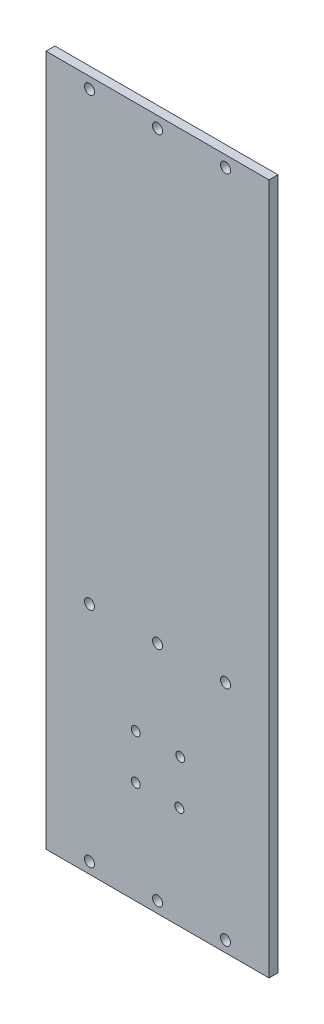
ISO-10303-21;
HEADER;
FILE_DESCRIPTION(('STEP AP214'),'2;1');
FILE_NAME('part.step','',(''),(''),'','','');
FILE_SCHEMA(('AUTOMOTIVE_DESIGN { 1 0 10303 214 1 1 1 1 }'));
ENDSEC;
DATA;
#1=APPLICATION_CONTEXT('core data for automotive mechanical design processes');
#2=APPLICATION_PROTOCOL_DEFINITION('international standard','automotive_design',2000,#1);
#3=PRODUCT_CONTEXT('',#1,'mechanical');
#4=PRODUCT('Part','Part','',(#3));
#5=PRODUCT_RELATED_PRODUCT_CATEGORY('part','',(#4));
#6=PRODUCT_DEFINITION_FORMATION('','',#4);
#7=PRODUCT_DEFINITION_CONTEXT('part definition',#1,'design');
#8=PRODUCT_DEFINITION('design','',#6,#7);
#9=PRODUCT_DEFINITION_SHAPE('','',#8);
#10=(LENGTH_UNIT() NAMED_UNIT(*) SI_UNIT(.MILLI.,.METRE.));
#11=(NAMED_UNIT(*) PLANE_ANGLE_UNIT() SI_UNIT($,.RADIAN.));
#12=(NAMED_UNIT(*) SI_UNIT($,.STERADIAN.) SOLID_ANGLE_UNIT());
#13=UNCERTAINTY_MEASURE_WITH_UNIT(LENGTH_MEASURE(1.E-05),#10,'distance_accuracy_value','');
#14=(GEOMETRIC_REPRESENTATION_CONTEXT(3) GLOBAL_UNCERTAINTY_ASSIGNED_CONTEXT((#13)) GLOBAL_UNIT_ASSIGNED_CONTEXT((#10,
#11,#12)) REPRESENTATION_CONTEXT('',''));
#15=CARTESIAN_POINT('',(0.,0.,0.));
#16=DIRECTION('',(0.,0.,1.));
#17=DIRECTION('',(1.,0.,0.));
#18=AXIS2_PLACEMENT_3D('',#15,#16,#17);
#19=CARTESIAN_POINT('',(0.,0.,-4.));
#20=DIRECTION('',(-1.,0.,0.));
#21=DIRECTION('',(0.,-1.,0.));
#22=AXIS2_PLACEMENT_3D('',#19,#20,#21);
#23=PLANE('',#22);
#24=DIRECTION('',(0.,-1.,0.));
#25=VECTOR('',#24,1.);
#26=CARTESIAN_POINT('',(0.,0.,0.));
#27=LINE('',#26,#25);
#28=CARTESIAN_POINT('',(0.,310.,0.));
#29=VERTEX_POINT('',#28);
#30=CARTESIAN_POINT('',(0.,0.,0.));
#31=VERTEX_POINT('',#30);
#32=EDGE_CURVE('E98',#29,#31,#27,.T.);
#33=ORIENTED_EDGE('',*,*,#32,.F.);
#34=DIRECTION('',(0.,0.,1.));
#35=VECTOR('',#34,1.);
#36=CARTESIAN_POINT('',(0.,310.,-4.));
#37=LINE('',#36,#35);
#38=CARTESIAN_POINT('',(0.,310.,-4.));
#39=VERTEX_POINT('',#38);
#40=EDGE_CURVE('E11',#39,#29,#37,.T.);
#41=ORIENTED_EDGE('',*,*,#40,.F.);
#42=DIRECTION('',(0.,-1.,0.));
#43=VECTOR('',#42,1.);
#44=CARTESIAN_POINT('',(0.,0.,-4.));
#45=LINE('',#44,#43);
#46=CARTESIAN_POINT('',(0.,0.,-4.));
#47=VERTEX_POINT('',#46);
#48=EDGE_CURVE('E91',#39,#47,#45,.T.);
#49=ORIENTED_EDGE('',*,*,#48,.T.);
#50=DIRECTION('',(0.,0.,1.));
#51=VECTOR('',#50,1.);
#52=CARTESIAN_POINT('',(0.,0.,-4.));
#53=LINE('',#52,#51);
#54=EDGE_CURVE('E36',#47,#31,#53,.T.);
#55=ORIENTED_EDGE('',*,*,#54,.T.);
#56=EDGE_LOOP('',(#33,#41,#49,#55));
#57=FACE_BOUND('',#56,.T.);
#58=ADVANCED_FACE('F33',(#57),#23,.T.);
#59=CARTESIAN_POINT('',(0.,310.,-4.));
#60=DIRECTION('',(0.,1.,0.));
#61=DIRECTION('',(0.,0.,1.));
#62=AXIS2_PLACEMENT_3D('',#59,#60,#61);
#63=PLANE('',#62);
#64=DIRECTION('',(-1.,0.,0.));
#65=VECTOR('',#64,1.);
#66=CARTESIAN_POINT('',(0.,310.,0.));
#67=LINE('',#66,#65);
#68=CARTESIAN_POINT('',(100.,310.,0.));
#69=VERTEX_POINT('',#68);
#70=EDGE_CURVE('E93',#69,#29,#67,.T.);
#71=ORIENTED_EDGE('',*,*,#70,.F.);
#72=DIRECTION('',(0.,0.,1.));
#73=VECTOR('',#72,1.);
#74=CARTESIAN_POINT('',(100.,310.,-4.));
#75=LINE('',#74,#73);
#76=CARTESIAN_POINT('',(100.,310.,-4.));
#77=VERTEX_POINT('',#76);
#78=EDGE_CURVE('E42',#77,#69,#75,.T.);
#79=ORIENTED_EDGE('',*,*,#78,.F.);
#80=DIRECTION('',(-1.,0.,0.));
#81=VECTOR('',#80,1.);
#82=CARTESIAN_POINT('',(0.,310.,-4.));
#83=LINE('',#82,#81);
#84=EDGE_CURVE('E88',#77,#39,#83,.T.);
#85=ORIENTED_EDGE('',*,*,#84,.T.);
#86=ORIENTED_EDGE('',*,*,#40,.T.);
#87=EDGE_LOOP('',(#71,#79,#85,#86));
#88=FACE_BOUND('',#87,.T.);
#89=ADVANCED_FACE('F109',(#88),#63,.T.);
#90=CARTESIAN_POINT('',(100.,0.,-4.));
#91=DIRECTION('',(1.,0.,0.));
#92=DIRECTION('',(0.,1.,0.));
#93=AXIS2_PLACEMENT_3D('',#90,#91,#92);
#94=PLANE('',#93);
#95=DIRECTION('',(0.,1.,0.));
#96=VECTOR('',#95,1.);
#97=CARTESIAN_POINT('',(100.,0.,0.));
#98=LINE('',#97,#96);
#99=CARTESIAN_POINT('',(100.,0.,0.));
#100=VERTEX_POINT('',#99);
#101=EDGE_CURVE('E83',#100,#69,#98,.T.);
#102=ORIENTED_EDGE('',*,*,#101,.F.);
#103=DIRECTION('',(0.,0.,1.));
#104=VECTOR('',#103,1.);
#105=CARTESIAN_POINT('',(100.,0.,-4.));
#106=LINE('',#105,#104);
#107=CARTESIAN_POINT('',(100.,0.,-4.));
#108=VERTEX_POINT('',#107);
#109=EDGE_CURVE('E78',#108,#100,#106,.T.);
#110=ORIENTED_EDGE('',*,*,#109,.F.);
#111=DIRECTION('',(0.,1.,0.));
#112=VECTOR('',#111,1.);
#113=CARTESIAN_POINT('',(100.,0.,-4.));
#114=LINE('',#113,#112);
#115=EDGE_CURVE('E81',#108,#77,#114,.T.);
#116=ORIENTED_EDGE('',*,*,#115,.T.);
#117=ORIENTED_EDGE('',*,*,#78,.T.);
#118=EDGE_LOOP('',(#102,#110,#116,#117));
#119=FACE_BOUND('',#118,.T.);
#120=ADVANCED_FACE('F80',(#119),#94,.T.);
#121=CARTESIAN_POINT('',(0.,0.,-4.));
#122=DIRECTION('',(0.,-1.,0.));
#123=DIRECTION('',(0.,0.,-1.));
#124=AXIS2_PLACEMENT_3D('',#121,#122,#123);
#125=PLANE('',#124);
#126=DIRECTION('',(1.,0.,0.));
#127=VECTOR('',#126,1.);
#128=CARTESIAN_POINT('',(0.,0.,0.));
#129=LINE('',#128,#127);
#130=EDGE_CURVE('E101',#31,#100,#129,.T.);
#131=ORIENTED_EDGE('',*,*,#130,.F.);
#132=ORIENTED_EDGE('',*,*,#54,.F.);
#133=DIRECTION('',(1.,0.,0.));
#134=VECTOR('',#133,1.);
#135=CARTESIAN_POINT('',(0.,0.,-4.));
#136=LINE('',#135,#134);
#137=EDGE_CURVE('E87',#47,#108,#136,.T.);
#138=ORIENTED_EDGE('',*,*,#137,.T.);
#139=ORIENTED_EDGE('',*,*,#109,.T.);
#140=EDGE_LOOP('',(#131,#132,#138,#139));
#141=FACE_BOUND('',#140,.T.);
#142=ADVANCED_FACE('F90',(#141),#125,.T.);
#143=CARTESIAN_POINT('',(0.,0.,-4.));
#144=DIRECTION('',(0.,0.,-1.));
#145=DIRECTION('',(-1.,0.,0.));
#146=AXIS2_PLACEMENT_3D('',#143,#144,#145);
#147=PLANE('',#146);
#148=CARTESIAN_POINT('',(19.5,105.,-4.));
#149=DIRECTION('',(0.,0.,1.));
#150=DIRECTION('',(1.,0.,0.));
#151=AXIS2_PLACEMENT_3D('',#148,#149,#150);
#152=CIRCLE('',#151,2.25);
#153=CARTESIAN_POINT('',(21.75,105.,-4.));
#154=VERTEX_POINT('',#153);
#155=EDGE_CURVE('E186',#154,#154,#152,.T.);
#156=ORIENTED_EDGE('',*,*,#155,.T.);
#157=EDGE_LOOP('',(#156));
#158=FACE_BOUND('',#157,.T.);
#159=CARTESIAN_POINT('',(80.5,105.,-4.));
#160=DIRECTION('',(0.,0.,1.));
#161=DIRECTION('',(-1.,0.,0.));
#162=AXIS2_PLACEMENT_3D('',#159,#160,#161);
#163=CIRCLE('',#162,2.25);
#164=CARTESIAN_POINT('',(78.25,105.,-4.));
#165=VERTEX_POINT('',#164);
#166=EDGE_CURVE('E194',#165,#165,#163,.T.);
#167=ORIENTED_EDGE('',*,*,#166,.T.);
#168=EDGE_LOOP('',(#167));
#169=FACE_BOUND('',#168,.T.);
#170=CARTESIAN_POINT('',(50.,105.,-4.));
#171=DIRECTION('',(0.,0.,1.));
#172=DIRECTION('',(1.,0.,0.));
#173=AXIS2_PLACEMENT_3D('',#170,#171,#172);
#174=CIRCLE('',#173,2.25);
#175=CARTESIAN_POINT('',(52.25,105.,-4.));
#176=VERTEX_POINT('',#175);
#177=EDGE_CURVE('E200',#176,#176,#174,.T.);
#178=ORIENTED_EDGE('',*,*,#177,.T.);
#179=EDGE_LOOP('',(#178));
#180=FACE_BOUND('',#179,.T.);
#181=CARTESIAN_POINT('',(60.2076344161803,66.000000000008,-4.));
#182=DIRECTION('',(0.,0.,1.));
#183=DIRECTION('',(1.,0.,0.));
#184=AXIS2_PLACEMENT_3D('',#181,#182,#183);
#185=CIRCLE('',#184,2.);
#186=CARTESIAN_POINT('',(62.2076344161803,66.000000000008,-4.));
#187=VERTEX_POINT('',#186);
#188=EDGE_CURVE('E206',#187,#187,#185,.T.);
#189=ORIENTED_EDGE('',*,*,#188,.T.);
#190=EDGE_LOOP('',(#189));
#191=FACE_BOUND('',#190,.T.);
#192=CARTESIAN_POINT('',(40.2076344161803,66.000000000008,-4.));
#193=DIRECTION('',(0.,0.,1.));
#194=DIRECTION('',(1.,0.,0.));
#195=AXIS2_PLACEMENT_3D('',#192,#193,#194);
#196=CIRCLE('',#195,2.);
#197=CARTESIAN_POINT('',(42.2076344161803,66.000000000008,-4.));
#198=VERTEX_POINT('',#197);
#199=EDGE_CURVE('E212',#198,#198,#196,.T.);
#200=ORIENTED_EDGE('',*,*,#199,.T.);
#201=EDGE_LOOP('',(#200));
#202=FACE_BOUND('',#201,.T.);
#203=CARTESIAN_POINT('',(59.7923655838197,46.000000000008,-4.));
#204=DIRECTION('',(0.,0.,1.));
#205=DIRECTION('',(-1.,0.,0.));
#206=AXIS2_PLACEMENT_3D('',#203,#204,#205);
#207=CIRCLE('',#206,2.);
#208=CARTESIAN_POINT('',(57.7923655838197,46.000000000008,-4.));
#209=VERTEX_POINT('',#208);
#210=EDGE_CURVE('E218',#209,#209,#207,.T.);
#211=ORIENTED_EDGE('',*,*,#210,.T.);
#212=EDGE_LOOP('',(#211));
#213=FACE_BOUND('',#212,.T.);
#214=CARTESIAN_POINT('',(40.2076344161803,46.000000000008,-4.));
#215=DIRECTION('',(0.,0.,1.));
#216=DIRECTION('',(1.,0.,0.));
#217=AXIS2_PLACEMENT_3D('',#214,#215,#216);
#218=CIRCLE('',#217,2.);
#219=CARTESIAN_POINT('',(42.2076344161803,46.000000000008,-4.));
#220=VERTEX_POINT('',#219);
#221=EDGE_CURVE('E224',#220,#220,#218,.T.);
#222=ORIENTED_EDGE('',*,*,#221,.T.);
#223=EDGE_LOOP('',(#222));
#224=FACE_BOUND('',#223,.T.);
#225=CARTESIAN_POINT('',(80.5,305.,-4.));
#226=DIRECTION('',(0.,0.,1.));
#227=DIRECTION('',(-1.,0.,0.));
#228=AXIS2_PLACEMENT_3D('',#225,#226,#227);
#229=CIRCLE('',#228,2.25);
#230=CARTESIAN_POINT('',(78.25,305.,-4.));
#231=VERTEX_POINT('',#230);
#232=EDGE_CURVE('E230',#231,#231,#229,.T.);
#233=ORIENTED_EDGE('',*,*,#232,.T.);
#234=EDGE_LOOP('',(#233));
#235=FACE_BOUND('',#234,.T.);
#236=CARTESIAN_POINT('',(50.,305.,-4.));
#237=DIRECTION('',(0.,0.,1.));
#238=DIRECTION('',(-1.,0.,0.));
#239=AXIS2_PLACEMENT_3D('',#236,#237,#238);
#240=CIRCLE('',#239,2.25);
#241=CARTESIAN_POINT('',(47.75,305.,-4.));
#242=VERTEX_POINT('',#241);
#243=EDGE_CURVE('E236',#242,#242,#240,.T.);
#244=ORIENTED_EDGE('',*,*,#243,.T.);
#245=EDGE_LOOP('',(#244));
#246=FACE_BOUND('',#245,.T.);
#247=CARTESIAN_POINT('',(19.5,5.,-4.));
#248=DIRECTION('',(0.,0.,1.));
#249=DIRECTION('',(-1.,0.,0.));
#250=AXIS2_PLACEMENT_3D('',#247,#248,#249);
#251=CIRCLE('',#250,2.25);
#252=CARTESIAN_POINT('',(17.25,5.,-4.));
#253=VERTEX_POINT('',#252);
#254=EDGE_CURVE('E242',#253,#253,#251,.T.);
#255=ORIENTED_EDGE('',*,*,#254,.T.);
#256=EDGE_LOOP('',(#255));
#257=FACE_BOUND('',#256,.T.);
#258=CARTESIAN_POINT('',(50.,5.,-4.));
#259=DIRECTION('',(0.,0.,1.));
#260=DIRECTION('',(1.,0.,0.));
#261=AXIS2_PLACEMENT_3D('',#258,#259,#260);
#262=CIRCLE('',#261,2.25);
#263=CARTESIAN_POINT('',(52.25,5.,-4.));
#264=VERTEX_POINT('',#263);
#265=EDGE_CURVE('E248',#264,#264,#262,.T.);
#266=ORIENTED_EDGE('',*,*,#265,.T.);
#267=EDGE_LOOP('',(#266));
#268=FACE_BOUND('',#267,.T.);
#269=CARTESIAN_POINT('',(80.5,5.,-4.));
#270=DIRECTION('',(0.,0.,1.));
#271=DIRECTION('',(1.,0.,0.));
#272=AXIS2_PLACEMENT_3D('',#269,#270,#271);
#273=CIRCLE('',#272,2.25);
#274=CARTESIAN_POINT('',(82.75,5.,-4.));
#275=VERTEX_POINT('',#274);
#276=EDGE_CURVE('E254',#275,#275,#273,.T.);
#277=ORIENTED_EDGE('',*,*,#276,.T.);
#278=EDGE_LOOP('',(#277));
#279=FACE_BOUND('',#278,.T.);
#280=CARTESIAN_POINT('',(19.5,305.,-4.));
#281=DIRECTION('',(0.,0.,1.));
#282=DIRECTION('',(1.,0.,0.));
#283=AXIS2_PLACEMENT_3D('',#280,#281,#282);
#284=CIRCLE('',#283,2.25);
#285=CARTESIAN_POINT('',(21.75,305.,-4.));
#286=VERTEX_POINT('',#285);
#287=EDGE_CURVE('E102',#286,#286,#284,.T.);
#288=ORIENTED_EDGE('',*,*,#287,.T.);
#289=EDGE_LOOP('',(#288));
#290=FACE_BOUND('',#289,.T.);
#291=ORIENTED_EDGE('',*,*,#48,.F.);
#292=ORIENTED_EDGE('',*,*,#84,.F.);
#293=ORIENTED_EDGE('',*,*,#115,.F.);
#294=ORIENTED_EDGE('',*,*,#137,.F.);
#295=EDGE_LOOP('',(#291,#292,#293,#294));
#296=FACE_BOUND('',#295,.T.);
#297=ADVANCED_FACE('F86',(#158,#169,#180,#191,#202,#213,#224,#235,#246,#257,#268,#279,#290,
#296),#147,.T.);
#298=CARTESIAN_POINT('',(0.,0.,0.));
#299=DIRECTION('',(0.,0.,-1.));
#300=DIRECTION('',(-1.,0.,0.));
#301=AXIS2_PLACEMENT_3D('',#298,#299,#300);
#302=PLANE('',#301);
#303=CARTESIAN_POINT('',(19.5,105.,0.));
#304=DIRECTION('',(0.,0.,1.));
#305=DIRECTION('',(1.,0.,0.));
#306=AXIS2_PLACEMENT_3D('',#303,#304,#305);
#307=CIRCLE('',#306,2.25);
#308=CARTESIAN_POINT('',(21.75,105.,0.));
#309=VERTEX_POINT('',#308);
#310=EDGE_CURVE('E189',#309,#309,#307,.T.);
#311=ORIENTED_EDGE('',*,*,#310,.F.);
#312=EDGE_LOOP('',(#311));
#313=FACE_BOUND('',#312,.T.);
#314=CARTESIAN_POINT('',(80.5,105.,0.));
#315=DIRECTION('',(0.,0.,1.));
#316=DIRECTION('',(-1.,0.,0.));
#317=AXIS2_PLACEMENT_3D('',#314,#315,#316);
#318=CIRCLE('',#317,2.25);
#319=CARTESIAN_POINT('',(78.25,105.,0.));
#320=VERTEX_POINT('',#319);
#321=EDGE_CURVE('E191',#320,#320,#318,.T.);
#322=ORIENTED_EDGE('',*,*,#321,.F.);
#323=EDGE_LOOP('',(#322));
#324=FACE_BOUND('',#323,.T.);
#325=CARTESIAN_POINT('',(50.,105.,0.));
#326=DIRECTION('',(0.,0.,1.));
#327=DIRECTION('',(1.,0.,0.));
#328=AXIS2_PLACEMENT_3D('',#325,#326,#327);
#329=CIRCLE('',#328,2.25);
#330=CARTESIAN_POINT('',(52.25,105.,0.));
#331=VERTEX_POINT('',#330);
#332=EDGE_CURVE('E197',#331,#331,#329,.T.);
#333=ORIENTED_EDGE('',*,*,#332,.F.);
#334=EDGE_LOOP('',(#333));
#335=FACE_BOUND('',#334,.T.);
#336=CARTESIAN_POINT('',(60.2076344161803,66.000000000008,0.));
#337=DIRECTION('',(0.,0.,1.));
#338=DIRECTION('',(1.,0.,0.));
#339=AXIS2_PLACEMENT_3D('',#336,#337,#338);
#340=CIRCLE('',#339,2.);
#341=CARTESIAN_POINT('',(62.2076344161803,66.000000000008,0.));
#342=VERTEX_POINT('',#341);
#343=EDGE_CURVE('E203',#342,#342,#340,.T.);
#344=ORIENTED_EDGE('',*,*,#343,.F.);
#345=EDGE_LOOP('',(#344));
#346=FACE_BOUND('',#345,.T.);
#347=CARTESIAN_POINT('',(40.2076344161803,66.000000000008,0.));
#348=DIRECTION('',(0.,0.,1.));
#349=DIRECTION('',(1.,0.,0.));
#350=AXIS2_PLACEMENT_3D('',#347,#348,#349);
#351=CIRCLE('',#350,2.);
#352=CARTESIAN_POINT('',(42.2076344161803,66.000000000008,0.));
#353=VERTEX_POINT('',#352);
#354=EDGE_CURVE('E209',#353,#353,#351,.T.);
#355=ORIENTED_EDGE('',*,*,#354,.F.);
#356=EDGE_LOOP('',(#355));
#357=FACE_BOUND('',#356,.T.);
#358=CARTESIAN_POINT('',(59.7923655838197,46.000000000008,0.));
#359=DIRECTION('',(0.,0.,1.));
#360=DIRECTION('',(-1.,0.,0.));
#361=AXIS2_PLACEMENT_3D('',#358,#359,#360);
#362=CIRCLE('',#361,2.);
#363=CARTESIAN_POINT('',(57.7923655838197,46.000000000008,0.));
#364=VERTEX_POINT('',#363);
#365=EDGE_CURVE('E215',#364,#364,#362,.T.);
#366=ORIENTED_EDGE('',*,*,#365,.F.);
#367=EDGE_LOOP('',(#366));
#368=FACE_BOUND('',#367,.T.);
#369=CARTESIAN_POINT('',(40.2076344161803,46.000000000008,0.));
#370=DIRECTION('',(0.,0.,1.));
#371=DIRECTION('',(1.,0.,0.));
#372=AXIS2_PLACEMENT_3D('',#369,#370,#371);
#373=CIRCLE('',#372,2.);
#374=CARTESIAN_POINT('',(42.2076344161803,46.000000000008,0.));
#375=VERTEX_POINT('',#374);
#376=EDGE_CURVE('E221',#375,#375,#373,.T.);
#377=ORIENTED_EDGE('',*,*,#376,.F.);
#378=EDGE_LOOP('',(#377));
#379=FACE_BOUND('',#378,.T.);
#380=CARTESIAN_POINT('',(80.5,305.,0.));
#381=DIRECTION('',(0.,0.,1.));
#382=DIRECTION('',(-1.,0.,0.));
#383=AXIS2_PLACEMENT_3D('',#380,#381,#382);
#384=CIRCLE('',#383,2.25);
#385=CARTESIAN_POINT('',(78.25,305.,0.));
#386=VERTEX_POINT('',#385);
#387=EDGE_CURVE('E227',#386,#386,#384,.T.);
#388=ORIENTED_EDGE('',*,*,#387,.F.);
#389=EDGE_LOOP('',(#388));
#390=FACE_BOUND('',#389,.T.);
#391=CARTESIAN_POINT('',(50.,305.,0.));
#392=DIRECTION('',(0.,0.,1.));
#393=DIRECTION('',(-1.,0.,0.));
#394=AXIS2_PLACEMENT_3D('',#391,#392,#393);
#395=CIRCLE('',#394,2.25);
#396=CARTESIAN_POINT('',(47.75,305.,0.));
#397=VERTEX_POINT('',#396);
#398=EDGE_CURVE('E233',#397,#397,#395,.T.);
#399=ORIENTED_EDGE('',*,*,#398,.F.);
#400=EDGE_LOOP('',(#399));
#401=FACE_BOUND('',#400,.T.);
#402=CARTESIAN_POINT('',(19.5,5.,0.));
#403=DIRECTION('',(0.,0.,1.));
#404=DIRECTION('',(-1.,0.,0.));
#405=AXIS2_PLACEMENT_3D('',#402,#403,#404);
#406=CIRCLE('',#405,2.25);
#407=CARTESIAN_POINT('',(17.25,5.,0.));
#408=VERTEX_POINT('',#407);
#409=EDGE_CURVE('E239',#408,#408,#406,.T.);
#410=ORIENTED_EDGE('',*,*,#409,.F.);
#411=EDGE_LOOP('',(#410));
#412=FACE_BOUND('',#411,.T.);
#413=CARTESIAN_POINT('',(50.,5.,0.));
#414=DIRECTION('',(0.,0.,1.));
#415=DIRECTION('',(1.,0.,0.));
#416=AXIS2_PLACEMENT_3D('',#413,#414,#415);
#417=CIRCLE('',#416,2.25);
#418=CARTESIAN_POINT('',(52.25,5.,0.));
#419=VERTEX_POINT('',#418);
#420=EDGE_CURVE('E245',#419,#419,#417,.T.);
#421=ORIENTED_EDGE('',*,*,#420,.F.);
#422=EDGE_LOOP('',(#421));
#423=FACE_BOUND('',#422,.T.);
#424=CARTESIAN_POINT('',(80.5,5.,0.));
#425=DIRECTION('',(0.,0.,1.));
#426=DIRECTION('',(1.,0.,0.));
#427=AXIS2_PLACEMENT_3D('',#424,#425,#426);
#428=CIRCLE('',#427,2.25);
#429=CARTESIAN_POINT('',(82.75,5.,0.));
#430=VERTEX_POINT('',#429);
#431=EDGE_CURVE('E251',#430,#430,#428,.T.);
#432=ORIENTED_EDGE('',*,*,#431,.F.);
#433=EDGE_LOOP('',(#432));
#434=FACE_BOUND('',#433,.T.);
#435=CARTESIAN_POINT('',(19.5,305.,0.));
#436=DIRECTION('',(0.,0.,1.));
#437=DIRECTION('',(1.,0.,0.));
#438=AXIS2_PLACEMENT_3D('',#435,#436,#437);
#439=CIRCLE('',#438,2.25);
#440=CARTESIAN_POINT('',(21.75,305.,0.));
#441=VERTEX_POINT('',#440);
#442=EDGE_CURVE('E257',#441,#441,#439,.T.);
#443=ORIENTED_EDGE('',*,*,#442,.F.);
#444=EDGE_LOOP('',(#443));
#445=FACE_BOUND('',#444,.T.);
#446=ORIENTED_EDGE('',*,*,#32,.T.);
#447=ORIENTED_EDGE('',*,*,#130,.T.);
#448=ORIENTED_EDGE('',*,*,#101,.T.);
#449=ORIENTED_EDGE('',*,*,#70,.T.);
#450=EDGE_LOOP('',(#446,#447,#448,#449));
#451=FACE_BOUND('',#450,.T.);
#452=ADVANCED_FACE('F108',(#313,#324,#335,#346,#357,#368,#379,#390,#401,#412,#423,#434,#445,
#451),#302,.F.);
#453=CARTESIAN_POINT('',(19.5,305.,-4.));
#454=DIRECTION('',(0.,0.,1.));
#455=DIRECTION('',(1.,0.,0.));
#456=AXIS2_PLACEMENT_3D('',#453,#454,#455);
#457=CYLINDRICAL_SURFACE('',#456,2.25);
#458=ORIENTED_EDGE('',*,*,#287,.F.);
#459=EDGE_LOOP('',(#458));
#460=FACE_BOUND('',#459,.T.);
#461=ORIENTED_EDGE('',*,*,#442,.T.);
#462=EDGE_LOOP('',(#461));
#463=FACE_BOUND('',#462,.T.);
#464=ADVANCED_FACE('F127',(#460,#463),#457,.F.);
#465=CARTESIAN_POINT('',(80.5,5.,-4.));
#466=DIRECTION('',(0.,0.,1.));
#467=DIRECTION('',(1.,0.,0.));
#468=AXIS2_PLACEMENT_3D('',#465,#466,#467);
#469=CYLINDRICAL_SURFACE('',#468,2.25);
#470=ORIENTED_EDGE('',*,*,#276,.F.);
#471=EDGE_LOOP('',(#470));
#472=FACE_BOUND('',#471,.T.);
#473=ORIENTED_EDGE('',*,*,#431,.T.);
#474=EDGE_LOOP('',(#473));
#475=FACE_BOUND('',#474,.T.);
#476=ADVANCED_FACE('F134',(#472,#475),#469,.F.);
#477=CARTESIAN_POINT('',(50.,5.,-4.));
#478=DIRECTION('',(0.,0.,1.));
#479=DIRECTION('',(1.,0.,0.));
#480=AXIS2_PLACEMENT_3D('',#477,#478,#479);
#481=CYLINDRICAL_SURFACE('',#480,2.25);
#482=ORIENTED_EDGE('',*,*,#265,.F.);
#483=EDGE_LOOP('',(#482));
#484=FACE_BOUND('',#483,.T.);
#485=ORIENTED_EDGE('',*,*,#420,.T.);
#486=EDGE_LOOP('',(#485));
#487=FACE_BOUND('',#486,.T.);
#488=ADVANCED_FACE('F138',(#484,#487),#481,.F.);
#489=CARTESIAN_POINT('',(19.5,5.,-4.));
#490=DIRECTION('',(0.,0.,1.));
#491=DIRECTION('',(1.,0.,0.));
#492=AXIS2_PLACEMENT_3D('',#489,#490,#491);
#493=CYLINDRICAL_SURFACE('',#492,2.25);
#494=ORIENTED_EDGE('',*,*,#254,.F.);
#495=EDGE_LOOP('',(#494));
#496=FACE_BOUND('',#495,.T.);
#497=ORIENTED_EDGE('',*,*,#409,.T.);
#498=EDGE_LOOP('',(#497));
#499=FACE_BOUND('',#498,.T.);
#500=ADVANCED_FACE('F142',(#496,#499),#493,.F.);
#501=CARTESIAN_POINT('',(50.,305.,-4.));
#502=DIRECTION('',(0.,0.,1.));
#503=DIRECTION('',(1.,0.,0.));
#504=AXIS2_PLACEMENT_3D('',#501,#502,#503);
#505=CYLINDRICAL_SURFACE('',#504,2.25);
#506=ORIENTED_EDGE('',*,*,#243,.F.);
#507=EDGE_LOOP('',(#506));
#508=FACE_BOUND('',#507,.T.);
#509=ORIENTED_EDGE('',*,*,#398,.T.);
#510=EDGE_LOOP('',(#509));
#511=FACE_BOUND('',#510,.T.);
#512=ADVANCED_FACE('F146',(#508,#511),#505,.F.);
#513=CARTESIAN_POINT('',(80.5,305.,-4.));
#514=DIRECTION('',(0.,0.,1.));
#515=DIRECTION('',(1.,0.,0.));
#516=AXIS2_PLACEMENT_3D('',#513,#514,#515);
#517=CYLINDRICAL_SURFACE('',#516,2.25);
#518=ORIENTED_EDGE('',*,*,#232,.F.);
#519=EDGE_LOOP('',(#518));
#520=FACE_BOUND('',#519,.T.);
#521=ORIENTED_EDGE('',*,*,#387,.T.);
#522=EDGE_LOOP('',(#521));
#523=FACE_BOUND('',#522,.T.);
#524=ADVANCED_FACE('F150',(#520,#523),#517,.F.);
#525=CARTESIAN_POINT('',(40.2076344161803,46.000000000008,-4.));
#526=DIRECTION('',(0.,0.,1.));
#527=DIRECTION('',(1.,0.,0.));
#528=AXIS2_PLACEMENT_3D('',#525,#526,#527);
#529=CYLINDRICAL_SURFACE('',#528,2.);
#530=ORIENTED_EDGE('',*,*,#221,.F.);
#531=EDGE_LOOP('',(#530));
#532=FACE_BOUND('',#531,.T.);
#533=ORIENTED_EDGE('',*,*,#376,.T.);
#534=EDGE_LOOP('',(#533));
#535=FACE_BOUND('',#534,.T.);
#536=ADVANCED_FACE('F154',(#532,#535),#529,.F.);
#537=CARTESIAN_POINT('',(59.7923655838197,46.000000000008,-4.));
#538=DIRECTION('',(0.,0.,1.));
#539=DIRECTION('',(1.,0.,0.));
#540=AXIS2_PLACEMENT_3D('',#537,#538,#539);
#541=CYLINDRICAL_SURFACE('',#540,2.);
#542=ORIENTED_EDGE('',*,*,#210,.F.);
#543=EDGE_LOOP('',(#542));
#544=FACE_BOUND('',#543,.T.);
#545=ORIENTED_EDGE('',*,*,#365,.T.);
#546=EDGE_LOOP('',(#545));
#547=FACE_BOUND('',#546,.T.);
#548=ADVANCED_FACE('F158',(#544,#547),#541,.F.);
#549=CARTESIAN_POINT('',(40.2076344161803,66.000000000008,-4.));
#550=DIRECTION('',(0.,0.,1.));
#551=DIRECTION('',(1.,0.,0.));
#552=AXIS2_PLACEMENT_3D('',#549,#550,#551);
#553=CYLINDRICAL_SURFACE('',#552,2.);
#554=ORIENTED_EDGE('',*,*,#199,.F.);
#555=EDGE_LOOP('',(#554));
#556=FACE_BOUND('',#555,.T.);
#557=ORIENTED_EDGE('',*,*,#354,.T.);
#558=EDGE_LOOP('',(#557));
#559=FACE_BOUND('',#558,.T.);
#560=ADVANCED_FACE('F162',(#556,#559),#553,.F.);
#561=CARTESIAN_POINT('',(60.2076344161803,66.000000000008,-4.));
#562=DIRECTION('',(0.,0.,1.));
#563=DIRECTION('',(1.,0.,0.));
#564=AXIS2_PLACEMENT_3D('',#561,#562,#563);
#565=CYLINDRICAL_SURFACE('',#564,2.);
#566=ORIENTED_EDGE('',*,*,#188,.F.);
#567=EDGE_LOOP('',(#566));
#568=FACE_BOUND('',#567,.T.);
#569=ORIENTED_EDGE('',*,*,#343,.T.);
#570=EDGE_LOOP('',(#569));
#571=FACE_BOUND('',#570,.T.);
#572=ADVANCED_FACE('F166',(#568,#571),#565,.F.);
#573=CARTESIAN_POINT('',(50.,105.,-4.));
#574=DIRECTION('',(0.,0.,1.));
#575=DIRECTION('',(1.,0.,0.));
#576=AXIS2_PLACEMENT_3D('',#573,#574,#575);
#577=CYLINDRICAL_SURFACE('',#576,2.25);
#578=ORIENTED_EDGE('',*,*,#177,.F.);
#579=EDGE_LOOP('',(#578));
#580=FACE_BOUND('',#579,.T.);
#581=ORIENTED_EDGE('',*,*,#332,.T.);
#582=EDGE_LOOP('',(#581));
#583=FACE_BOUND('',#582,.T.);
#584=ADVANCED_FACE('F170',(#580,#583),#577,.F.);
#585=CARTESIAN_POINT('',(80.5,105.,-4.));
#586=DIRECTION('',(0.,0.,1.));
#587=DIRECTION('',(1.,0.,0.));
#588=AXIS2_PLACEMENT_3D('',#585,#586,#587);
#589=CYLINDRICAL_SURFACE('',#588,2.25);
#590=ORIENTED_EDGE('',*,*,#166,.F.);
#591=EDGE_LOOP('',(#590));
#592=FACE_BOUND('',#591,.T.);
#593=ORIENTED_EDGE('',*,*,#321,.T.);
#594=EDGE_LOOP('',(#593));
#595=FACE_BOUND('',#594,.T.);
#596=ADVANCED_FACE('F174',(#592,#595),#589,.F.);
#597=CARTESIAN_POINT('',(19.5,105.,-4.));
#598=DIRECTION('',(0.,0.,1.));
#599=DIRECTION('',(1.,0.,0.));
#600=AXIS2_PLACEMENT_3D('',#597,#598,#599);
#601=CYLINDRICAL_SURFACE('',#600,2.25);
#602=ORIENTED_EDGE('',*,*,#155,.F.);
#603=EDGE_LOOP('',(#602));
#604=FACE_BOUND('',#603,.T.);
#605=ORIENTED_EDGE('',*,*,#310,.T.);
#606=EDGE_LOOP('',(#605));
#607=FACE_BOUND('',#606,.T.);
#608=ADVANCED_FACE('F178',(#604,#607),#601,.F.);
#609=CLOSED_SHELL('',(#58,#89,#120,#142,#297,#452,#464,#476,#488,#500,#512,#524,#536,#548,#560,
#572,#584,#596,#608));
#610=MANIFOLD_SOLID_BREP('B2',#609);
#611=ADVANCED_BREP_SHAPE_REPRESENTATION('',(#18,#610),#14);
#612=SHAPE_DEFINITION_REPRESENTATION(#9,#611);
ENDSEC;
END-ISO-10303-21;
